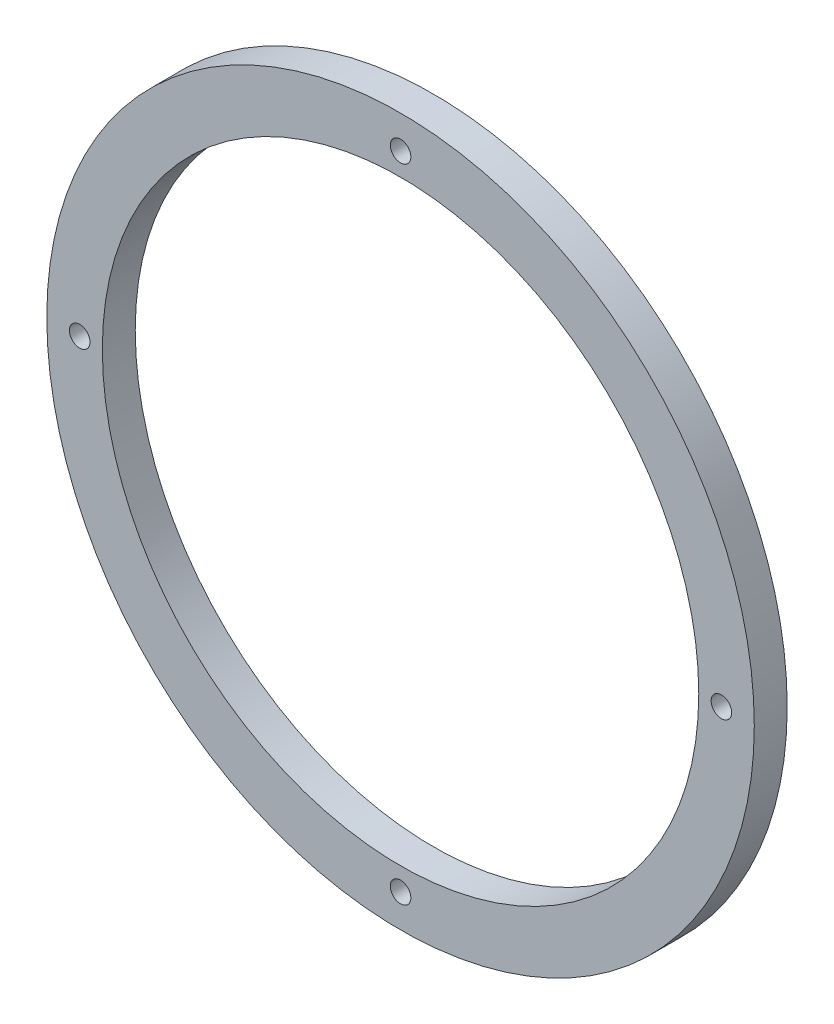
ISO-10303-21;
HEADER;
FILE_DESCRIPTION(('STEP AP214'),'2;1');
FILE_NAME('part.step','',(''),(''),'','','');
FILE_SCHEMA(('AUTOMOTIVE_DESIGN { 1 0 10303 214 1 1 1 1 }'));
ENDSEC;
DATA;
#1=APPLICATION_CONTEXT('core data for automotive mechanical design processes');
#2=APPLICATION_PROTOCOL_DEFINITION('international standard','automotive_design',2000,#1);
#3=PRODUCT_CONTEXT('',#1,'mechanical');
#4=PRODUCT('Part','Part','',(#3));
#5=PRODUCT_RELATED_PRODUCT_CATEGORY('part','',(#4));
#6=PRODUCT_DEFINITION_FORMATION('','',#4);
#7=PRODUCT_DEFINITION_CONTEXT('part definition',#1,'design');
#8=PRODUCT_DEFINITION('design','',#6,#7);
#9=PRODUCT_DEFINITION_SHAPE('','',#8);
#10=(LENGTH_UNIT() NAMED_UNIT(*) SI_UNIT(.MILLI.,.METRE.));
#11=(NAMED_UNIT(*) PLANE_ANGLE_UNIT() SI_UNIT($,.RADIAN.));
#12=(NAMED_UNIT(*) SI_UNIT($,.STERADIAN.) SOLID_ANGLE_UNIT());
#13=UNCERTAINTY_MEASURE_WITH_UNIT(LENGTH_MEASURE(1.E-05),#10,'distance_accuracy_value','');
#14=(GEOMETRIC_REPRESENTATION_CONTEXT(3) GLOBAL_UNCERTAINTY_ASSIGNED_CONTEXT((#13)) GLOBAL_UNIT_ASSIGNED_CONTEXT((#10,
#11,#12)) REPRESENTATION_CONTEXT('',''));
#15=CARTESIAN_POINT('',(0.,0.,0.));
#16=DIRECTION('',(0.,0.,1.));
#17=DIRECTION('',(1.,0.,0.));
#18=AXIS2_PLACEMENT_3D('',#15,#16,#17);
#19=CARTESIAN_POINT('',(0.,0.,8.));
#20=DIRECTION('',(0.,0.,1.));
#21=DIRECTION('',(1.,0.,0.));
#22=AXIS2_PLACEMENT_3D('',#19,#20,#21);
#23=PLANE('',#22);
#24=CARTESIAN_POINT('',(0.,-78.,8.));
#25=DIRECTION('',(0.,0.,1.));
#26=DIRECTION('',(1.,0.,0.));
#27=AXIS2_PLACEMENT_3D('',#24,#25,#26);
#28=CIRCLE('',#27,2.5);
#29=CARTESIAN_POINT('',(2.50000000000001,-78.,8.));
#30=VERTEX_POINT('',#29);
#31=EDGE_CURVE('E76',#30,#30,#28,.T.);
#32=ORIENTED_EDGE('',*,*,#31,.F.);
#33=EDGE_LOOP('',(#32));
#34=FACE_BOUND('',#33,.T.);
#35=CARTESIAN_POINT('',(0.,78.,8.));
#36=DIRECTION('',(0.,0.,1.));
#37=DIRECTION('',(1.,0.,0.));
#38=AXIS2_PLACEMENT_3D('',#35,#36,#37);
#39=CIRCLE('',#38,2.5);
#40=CARTESIAN_POINT('',(2.5,78.,8.));
#41=VERTEX_POINT('',#40);
#42=EDGE_CURVE('E60',#41,#41,#39,.T.);
#43=ORIENTED_EDGE('',*,*,#42,.F.);
#44=EDGE_LOOP('',(#43));
#45=FACE_BOUND('',#44,.T.);
#46=CARTESIAN_POINT('',(0.,0.,8.));
#47=DIRECTION('',(0.,0.,1.));
#48=DIRECTION('',(1.,0.,0.));
#49=AXIS2_PLACEMENT_3D('',#46,#47,#48);
#50=CIRCLE('',#49,86.);
#51=CARTESIAN_POINT('',(86.,0.,8.));
#52=VERTEX_POINT('',#51);
#53=EDGE_CURVE('E10',#52,#52,#50,.T.);
#54=ORIENTED_EDGE('',*,*,#53,.T.);
#55=EDGE_LOOP('',(#54));
#56=FACE_BOUND('',#55,.T.);
#57=CARTESIAN_POINT('',(0.,0.,8.));
#58=DIRECTION('',(0.,0.,1.));
#59=DIRECTION('',(1.,0.,0.));
#60=AXIS2_PLACEMENT_3D('',#57,#58,#59);
#61=CIRCLE('',#60,72.5);
#62=CARTESIAN_POINT('',(72.5,0.,8.));
#63=VERTEX_POINT('',#62);
#64=EDGE_CURVE('E54',#63,#63,#61,.T.);
#65=ORIENTED_EDGE('',*,*,#64,.F.);
#66=EDGE_LOOP('',(#65));
#67=FACE_BOUND('',#66,.T.);
#68=CARTESIAN_POINT('',(78.,0.,8.));
#69=DIRECTION('',(0.,0.,1.));
#70=DIRECTION('',(1.,0.,0.));
#71=AXIS2_PLACEMENT_3D('',#68,#69,#70);
#72=CIRCLE('',#71,2.50000000000001);
#73=CARTESIAN_POINT('',(80.5,0.,8.));
#74=VERTEX_POINT('',#73);
#75=EDGE_CURVE('E68',#74,#74,#72,.T.);
#76=ORIENTED_EDGE('',*,*,#75,.F.);
#77=EDGE_LOOP('',(#76));
#78=FACE_BOUND('',#77,.T.);
#79=CARTESIAN_POINT('',(-78.,0.,8.));
#80=DIRECTION('',(0.,0.,1.));
#81=DIRECTION('',(1.,0.,0.));
#82=AXIS2_PLACEMENT_3D('',#79,#80,#81);
#83=CIRCLE('',#82,2.50000000000001);
#84=CARTESIAN_POINT('',(-75.5,0.,8.));
#85=VERTEX_POINT('',#84);
#86=EDGE_CURVE('E84',#85,#85,#83,.T.);
#87=ORIENTED_EDGE('',*,*,#86,.F.);
#88=EDGE_LOOP('',(#87));
#89=FACE_BOUND('',#88,.T.);
#90=ADVANCED_FACE('F41',(#34,#45,#56,#67,#78,#89),#23,.T.);
#91=CARTESIAN_POINT('',(0.,0.,0.));
#92=DIRECTION('',(0.,0.,1.));
#93=DIRECTION('',(1.,0.,0.));
#94=AXIS2_PLACEMENT_3D('',#91,#92,#93);
#95=PLANE('',#94);
#96=CARTESIAN_POINT('',(0.,0.,0.));
#97=DIRECTION('',(0.,0.,1.));
#98=DIRECTION('',(1.,0.,0.));
#99=AXIS2_PLACEMENT_3D('',#96,#97,#98);
#100=CIRCLE('',#99,86.);
#101=CARTESIAN_POINT('',(86.,0.,0.));
#102=VERTEX_POINT('',#101);
#103=EDGE_CURVE('E45',#102,#102,#100,.T.);
#104=ORIENTED_EDGE('',*,*,#103,.F.);
#105=EDGE_LOOP('',(#104));
#106=FACE_BOUND('',#105,.T.);
#107=CARTESIAN_POINT('',(0.,0.,0.));
#108=DIRECTION('',(0.,0.,1.));
#109=DIRECTION('',(1.,0.,0.));
#110=AXIS2_PLACEMENT_3D('',#107,#108,#109);
#111=CIRCLE('',#110,72.5);
#112=CARTESIAN_POINT('',(72.5,0.,0.));
#113=VERTEX_POINT('',#112);
#114=EDGE_CURVE('E56',#113,#113,#111,.T.);
#115=ORIENTED_EDGE('',*,*,#114,.T.);
#116=EDGE_LOOP('',(#115));
#117=FACE_BOUND('',#116,.T.);
#118=CARTESIAN_POINT('',(0.,78.,0.));
#119=DIRECTION('',(0.,0.,1.));
#120=DIRECTION('',(1.,0.,0.));
#121=AXIS2_PLACEMENT_3D('',#118,#119,#120);
#122=CIRCLE('',#121,2.5);
#123=CARTESIAN_POINT('',(2.5,78.,0.));
#124=VERTEX_POINT('',#123);
#125=EDGE_CURVE('E64',#124,#124,#122,.T.);
#126=ORIENTED_EDGE('',*,*,#125,.T.);
#127=EDGE_LOOP('',(#126));
#128=FACE_BOUND('',#127,.T.);
#129=CARTESIAN_POINT('',(78.,0.,0.));
#130=DIRECTION('',(0.,0.,1.));
#131=DIRECTION('',(1.,0.,0.));
#132=AXIS2_PLACEMENT_3D('',#129,#130,#131);
#133=CIRCLE('',#132,2.50000000000001);
#134=CARTESIAN_POINT('',(80.5,0.,0.));
#135=VERTEX_POINT('',#134);
#136=EDGE_CURVE('E72',#135,#135,#133,.T.);
#137=ORIENTED_EDGE('',*,*,#136,.T.);
#138=EDGE_LOOP('',(#137));
#139=FACE_BOUND('',#138,.T.);
#140=CARTESIAN_POINT('',(0.,-78.,0.));
#141=DIRECTION('',(0.,0.,1.));
#142=DIRECTION('',(1.,0.,0.));
#143=AXIS2_PLACEMENT_3D('',#140,#141,#142);
#144=CIRCLE('',#143,2.5);
#145=CARTESIAN_POINT('',(2.50000000000001,-78.,0.));
#146=VERTEX_POINT('',#145);
#147=EDGE_CURVE('E80',#146,#146,#144,.T.);
#148=ORIENTED_EDGE('',*,*,#147,.T.);
#149=EDGE_LOOP('',(#148));
#150=FACE_BOUND('',#149,.T.);
#151=CARTESIAN_POINT('',(-78.,0.,0.));
#152=DIRECTION('',(0.,0.,1.));
#153=DIRECTION('',(1.,0.,0.));
#154=AXIS2_PLACEMENT_3D('',#151,#152,#153);
#155=CIRCLE('',#154,2.50000000000001);
#156=CARTESIAN_POINT('',(-75.5,0.,0.));
#157=VERTEX_POINT('',#156);
#158=EDGE_CURVE('E88',#157,#157,#155,.T.);
#159=ORIENTED_EDGE('',*,*,#158,.T.);
#160=EDGE_LOOP('',(#159));
#161=FACE_BOUND('',#160,.T.);
#162=ADVANCED_FACE('F100',(#106,#117,#128,#139,#150,#161),#95,.F.);
#163=CARTESIAN_POINT('',(0.,0.,8.));
#164=DIRECTION('',(0.,0.,-1.));
#165=DIRECTION('',(-1.,0.,0.));
#166=AXIS2_PLACEMENT_3D('',#163,#164,#165);
#167=CYLINDRICAL_SURFACE('',#166,86.);
#168=ORIENTED_EDGE('',*,*,#53,.F.);
#169=EDGE_LOOP('',(#168));
#170=FACE_BOUND('',#169,.T.);
#171=ORIENTED_EDGE('',*,*,#103,.T.);
#172=EDGE_LOOP('',(#171));
#173=FACE_BOUND('',#172,.T.);
#174=ADVANCED_FACE('F43',(#170,#173),#167,.T.);
#175=CARTESIAN_POINT('',(0.,0.,8.));
#176=DIRECTION('',(0.,0.,-1.));
#177=DIRECTION('',(-1.,0.,0.));
#178=AXIS2_PLACEMENT_3D('',#175,#176,#177);
#179=CYLINDRICAL_SURFACE('',#178,72.5);
#180=ORIENTED_EDGE('',*,*,#64,.T.);
#181=EDGE_LOOP('',(#180));
#182=FACE_BOUND('',#181,.T.);
#183=ORIENTED_EDGE('',*,*,#114,.F.);
#184=EDGE_LOOP('',(#183));
#185=FACE_BOUND('',#184,.T.);
#186=ADVANCED_FACE('F110',(#182,#185),#179,.F.);
#187=CARTESIAN_POINT('',(0.,78.,8.));
#188=DIRECTION('',(0.,0.,-1.));
#189=DIRECTION('',(-1.,0.,0.));
#190=AXIS2_PLACEMENT_3D('',#187,#188,#189);
#191=CYLINDRICAL_SURFACE('',#190,2.5);
#192=ORIENTED_EDGE('',*,*,#42,.T.);
#193=EDGE_LOOP('',(#192));
#194=FACE_BOUND('',#193,.T.);
#195=ORIENTED_EDGE('',*,*,#125,.F.);
#196=EDGE_LOOP('',(#195));
#197=FACE_BOUND('',#196,.T.);
#198=ADVANCED_FACE('F113',(#194,#197),#191,.F.);
#199=CARTESIAN_POINT('',(78.,0.,8.));
#200=DIRECTION('',(0.,0.,-1.));
#201=DIRECTION('',(-1.,0.,0.));
#202=AXIS2_PLACEMENT_3D('',#199,#200,#201);
#203=CYLINDRICAL_SURFACE('',#202,2.50000000000001);
#204=ORIENTED_EDGE('',*,*,#75,.T.);
#205=EDGE_LOOP('',(#204));
#206=FACE_BOUND('',#205,.T.);
#207=ORIENTED_EDGE('',*,*,#136,.F.);
#208=EDGE_LOOP('',(#207));
#209=FACE_BOUND('',#208,.T.);
#210=ADVANCED_FACE('F117',(#206,#209),#203,.F.);
#211=CARTESIAN_POINT('',(0.,-78.,8.));
#212=DIRECTION('',(0.,0.,-1.));
#213=DIRECTION('',(-1.,0.,0.));
#214=AXIS2_PLACEMENT_3D('',#211,#212,#213);
#215=CYLINDRICAL_SURFACE('',#214,2.5);
#216=ORIENTED_EDGE('',*,*,#31,.T.);
#217=EDGE_LOOP('',(#216));
#218=FACE_BOUND('',#217,.T.);
#219=ORIENTED_EDGE('',*,*,#147,.F.);
#220=EDGE_LOOP('',(#219));
#221=FACE_BOUND('',#220,.T.);
#222=ADVANCED_FACE('F121',(#218,#221),#215,.F.);
#223=CARTESIAN_POINT('',(-78.,0.,8.));
#224=DIRECTION('',(0.,0.,-1.));
#225=DIRECTION('',(-1.,0.,0.));
#226=AXIS2_PLACEMENT_3D('',#223,#224,#225);
#227=CYLINDRICAL_SURFACE('',#226,2.50000000000001);
#228=ORIENTED_EDGE('',*,*,#86,.T.);
#229=EDGE_LOOP('',(#228));
#230=FACE_BOUND('',#229,.T.);
#231=ORIENTED_EDGE('',*,*,#158,.F.);
#232=EDGE_LOOP('',(#231));
#233=FACE_BOUND('',#232,.T.);
#234=ADVANCED_FACE('F96',(#230,#233),#227,.F.);
#235=CLOSED_SHELL('',(#90,#162,#174,#186,#198,#210,#222,#234));
#236=MANIFOLD_SOLID_BREP('B2',#235);
#237=ADVANCED_BREP_SHAPE_REPRESENTATION('',(#18,#236),#14);
#238=SHAPE_DEFINITION_REPRESENTATION(#9,#237);
ENDSEC;
END-ISO-10303-21;
